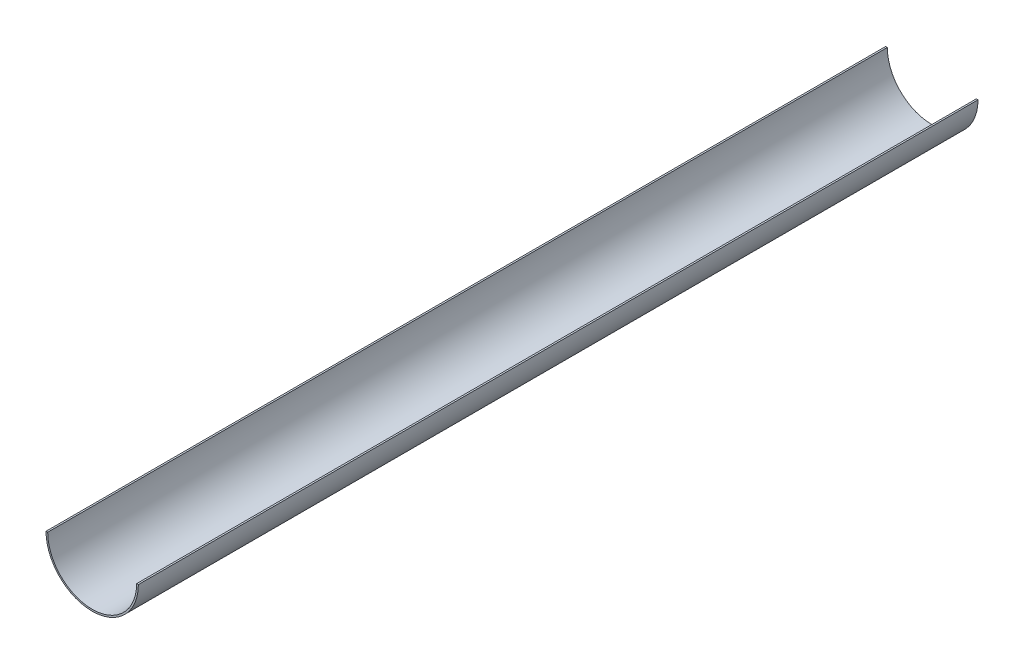
ISO-10303-21;
HEADER;
FILE_DESCRIPTION(('STEP AP214'),'2;1');
FILE_NAME('part.step','',(''),(''),'','','');
FILE_SCHEMA(('AUTOMOTIVE_DESIGN { 1 0 10303 214 1 1 1 1 }'));
ENDSEC;
DATA;
#1=APPLICATION_CONTEXT('core data for automotive mechanical design processes');
#2=APPLICATION_PROTOCOL_DEFINITION('international standard','automotive_design',2000,#1);
#3=PRODUCT_CONTEXT('',#1,'mechanical');
#4=PRODUCT('Part','Part','',(#3));
#5=PRODUCT_RELATED_PRODUCT_CATEGORY('part','',(#4));
#6=PRODUCT_DEFINITION_FORMATION('','',#4);
#7=PRODUCT_DEFINITION_CONTEXT('part definition',#1,'design');
#8=PRODUCT_DEFINITION('design','',#6,#7);
#9=PRODUCT_DEFINITION_SHAPE('','',#8);
#10=(LENGTH_UNIT() NAMED_UNIT(*) SI_UNIT(.MILLI.,.METRE.));
#11=(NAMED_UNIT(*) PLANE_ANGLE_UNIT() SI_UNIT($,.RADIAN.));
#12=(NAMED_UNIT(*) SI_UNIT($,.STERADIAN.) SOLID_ANGLE_UNIT());
#13=UNCERTAINTY_MEASURE_WITH_UNIT(LENGTH_MEASURE(1.E-05),#10,'distance_accuracy_value','');
#14=(GEOMETRIC_REPRESENTATION_CONTEXT(3) GLOBAL_UNCERTAINTY_ASSIGNED_CONTEXT((#13)) GLOBAL_UNIT_ASSIGNED_CONTEXT((#10,
#11,#12)) REPRESENTATION_CONTEXT('',''));
#15=CARTESIAN_POINT('',(0.,0.,0.));
#16=DIRECTION('',(0.,0.,1.));
#17=DIRECTION('',(1.,0.,0.));
#18=AXIS2_PLACEMENT_3D('',#15,#16,#17);
#19=CARTESIAN_POINT('',(0.,0.,1000.));
#20=DIRECTION('',(0.,0.,-1.));
#21=DIRECTION('',(-1.,0.,0.));
#22=AXIS2_PLACEMENT_3D('',#19,#20,#21);
#23=CYLINDRICAL_SURFACE('',#22,53.);
#24=CARTESIAN_POINT('',(0.,0.,0.));
#25=DIRECTION('',(0.,0.,-1.));
#26=DIRECTION('',(1.,0.,0.));
#27=AXIS2_PLACEMENT_3D('',#24,#25,#26);
#28=CIRCLE('',#27,53.);
#29=CARTESIAN_POINT('',(53.,0.,0.));
#30=VERTEX_POINT('',#29);
#31=CARTESIAN_POINT('',(-53.,0.,0.));
#32=VERTEX_POINT('',#31);
#33=EDGE_CURVE('E107',#30,#32,#28,.T.);
#34=ORIENTED_EDGE('',*,*,#33,.T.);
#35=DIRECTION('',(0.,0.,-1.));
#36=VECTOR('',#35,1.);
#37=CARTESIAN_POINT('',(-53.,0.,1000.));
#38=LINE('',#37,#36);
#39=CARTESIAN_POINT('',(-53.,0.,1000.));
#40=VERTEX_POINT('',#39);
#41=EDGE_CURVE('E11',#40,#32,#38,.T.);
#42=ORIENTED_EDGE('',*,*,#41,.F.);
#43=CARTESIAN_POINT('',(0.,0.,1000.));
#44=DIRECTION('',(0.,0.,-1.));
#45=DIRECTION('',(1.,0.,0.));
#46=AXIS2_PLACEMENT_3D('',#43,#44,#45);
#47=CIRCLE('',#46,53.);
#48=CARTESIAN_POINT('',(53.,0.,1000.));
#49=VERTEX_POINT('',#48);
#50=EDGE_CURVE('E90',#49,#40,#47,.T.);
#51=ORIENTED_EDGE('',*,*,#50,.F.);
#52=DIRECTION('',(0.,0.,-1.));
#53=VECTOR('',#52,1.);
#54=CARTESIAN_POINT('',(53.,0.,1000.));
#55=LINE('',#54,#53);
#56=EDGE_CURVE('E103',#49,#30,#55,.T.);
#57=ORIENTED_EDGE('',*,*,#56,.T.);
#58=EDGE_LOOP('',(#34,#42,#51,#57));
#59=FACE_BOUND('',#58,.T.);
#60=ADVANCED_FACE('F38',(#59),#23,.F.);
#61=CARTESIAN_POINT('',(-53.,0.,1000.));
#62=DIRECTION('',(0.,-1.,0.));
#63=DIRECTION('',(0.,0.,-1.));
#64=AXIS2_PLACEMENT_3D('',#61,#62,#63);
#65=PLANE('',#64);
#66=DIRECTION('',(-1.,0.,0.));
#67=VECTOR('',#66,1.);
#68=CARTESIAN_POINT('',(-53.,0.,0.));
#69=LINE('',#68,#67);
#70=CARTESIAN_POINT('',(-55.,0.,0.));
#71=VERTEX_POINT('',#70);
#72=EDGE_CURVE('E95',#32,#71,#69,.T.);
#73=ORIENTED_EDGE('',*,*,#72,.T.);
#74=DIRECTION('',(0.,0.,-1.));
#75=VECTOR('',#74,1.);
#76=CARTESIAN_POINT('',(-55.,0.,1000.));
#77=LINE('',#76,#75);
#78=CARTESIAN_POINT('',(-55.,0.,1000.));
#79=VERTEX_POINT('',#78);
#80=EDGE_CURVE('E47',#79,#71,#77,.T.);
#81=ORIENTED_EDGE('',*,*,#80,.F.);
#82=DIRECTION('',(-1.,0.,0.));
#83=VECTOR('',#82,1.);
#84=CARTESIAN_POINT('',(-53.,0.,1000.));
#85=LINE('',#84,#83);
#86=EDGE_CURVE('E85',#40,#79,#85,.T.);
#87=ORIENTED_EDGE('',*,*,#86,.F.);
#88=ORIENTED_EDGE('',*,*,#41,.T.);
#89=EDGE_LOOP('',(#73,#81,#87,#88));
#90=FACE_BOUND('',#89,.T.);
#91=ADVANCED_FACE('F94',(#90),#65,.F.);
#92=CARTESIAN_POINT('',(0.,0.,1000.));
#93=DIRECTION('',(0.,0.,-1.));
#94=DIRECTION('',(-1.,0.,0.));
#95=AXIS2_PLACEMENT_3D('',#92,#93,#94);
#96=CYLINDRICAL_SURFACE('',#95,55.);
#97=CARTESIAN_POINT('',(0.,0.,0.));
#98=DIRECTION('',(0.,0.,1.));
#99=DIRECTION('',(1.,0.,0.));
#100=AXIS2_PLACEMENT_3D('',#97,#98,#99);
#101=CIRCLE('',#100,55.);
#102=CARTESIAN_POINT('',(55.,0.,0.));
#103=VERTEX_POINT('',#102);
#104=EDGE_CURVE('E72',#71,#103,#101,.T.);
#105=ORIENTED_EDGE('',*,*,#104,.T.);
#106=DIRECTION('',(0.,0.,-1.));
#107=VECTOR('',#106,1.);
#108=CARTESIAN_POINT('',(55.,0.,1000.));
#109=LINE('',#108,#107);
#110=CARTESIAN_POINT('',(55.,0.,1000.));
#111=VERTEX_POINT('',#110);
#112=EDGE_CURVE('E97',#111,#103,#109,.T.);
#113=ORIENTED_EDGE('',*,*,#112,.F.);
#114=CARTESIAN_POINT('',(0.,0.,1000.));
#115=DIRECTION('',(0.,0.,1.));
#116=DIRECTION('',(1.,0.,0.));
#117=AXIS2_PLACEMENT_3D('',#114,#115,#116);
#118=CIRCLE('',#117,55.);
#119=EDGE_CURVE('E88',#79,#111,#118,.T.);
#120=ORIENTED_EDGE('',*,*,#119,.F.);
#121=ORIENTED_EDGE('',*,*,#80,.T.);
#122=EDGE_LOOP('',(#105,#113,#120,#121));
#123=FACE_BOUND('',#122,.T.);
#124=ADVANCED_FACE('F98',(#123),#96,.T.);
#125=CARTESIAN_POINT('',(53.,0.,1000.));
#126=DIRECTION('',(0.,-1.,0.));
#127=DIRECTION('',(0.,0.,-1.));
#128=AXIS2_PLACEMENT_3D('',#125,#126,#127);
#129=PLANE('',#128);
#130=DIRECTION('',(-1.,0.,0.));
#131=VECTOR('',#130,1.);
#132=CARTESIAN_POINT('',(53.,0.,0.));
#133=LINE('',#132,#131);
#134=EDGE_CURVE('E78',#103,#30,#133,.T.);
#135=ORIENTED_EDGE('',*,*,#134,.T.);
#136=ORIENTED_EDGE('',*,*,#56,.F.);
#137=DIRECTION('',(-1.,0.,0.));
#138=VECTOR('',#137,1.);
#139=CARTESIAN_POINT('',(53.,0.,1000.));
#140=LINE('',#139,#138);
#141=EDGE_CURVE('E55',#111,#49,#140,.T.);
#142=ORIENTED_EDGE('',*,*,#141,.F.);
#143=ORIENTED_EDGE('',*,*,#112,.T.);
#144=EDGE_LOOP('',(#135,#136,#142,#143));
#145=FACE_BOUND('',#144,.T.);
#146=ADVANCED_FACE('F121',(#145),#129,.F.);
#147=CARTESIAN_POINT('',(0.,0.,1000.));
#148=DIRECTION('',(0.,0.,1.));
#149=DIRECTION('',(1.,0.,0.));
#150=AXIS2_PLACEMENT_3D('',#147,#148,#149);
#151=PLANE('',#150);
#152=ORIENTED_EDGE('',*,*,#50,.T.);
#153=ORIENTED_EDGE('',*,*,#86,.T.);
#154=ORIENTED_EDGE('',*,*,#119,.T.);
#155=ORIENTED_EDGE('',*,*,#141,.T.);
#156=EDGE_LOOP('',(#152,#153,#154,#155));
#157=FACE_BOUND('',#156,.T.);
#158=ADVANCED_FACE('F86',(#157),#151,.T.);
#159=CARTESIAN_POINT('',(0.,0.,0.));
#160=DIRECTION('',(0.,0.,1.));
#161=DIRECTION('',(1.,0.,0.));
#162=AXIS2_PLACEMENT_3D('',#159,#160,#161);
#163=PLANE('',#162);
#164=ORIENTED_EDGE('',*,*,#33,.F.);
#165=ORIENTED_EDGE('',*,*,#134,.F.);
#166=ORIENTED_EDGE('',*,*,#104,.F.);
#167=ORIENTED_EDGE('',*,*,#72,.F.);
#168=EDGE_LOOP('',(#164,#165,#166,#167));
#169=FACE_BOUND('',#168,.T.);
#170=ADVANCED_FACE('F124',(#169),#163,.F.);
#171=CLOSED_SHELL('',(#60,#91,#124,#146,#158,#170));
#172=MANIFOLD_SOLID_BREP('B2',#171);
#173=ADVANCED_BREP_SHAPE_REPRESENTATION('',(#18,#172),#14);
#174=SHAPE_DEFINITION_REPRESENTATION(#9,#173);
ENDSEC;
END-ISO-10303-21;
